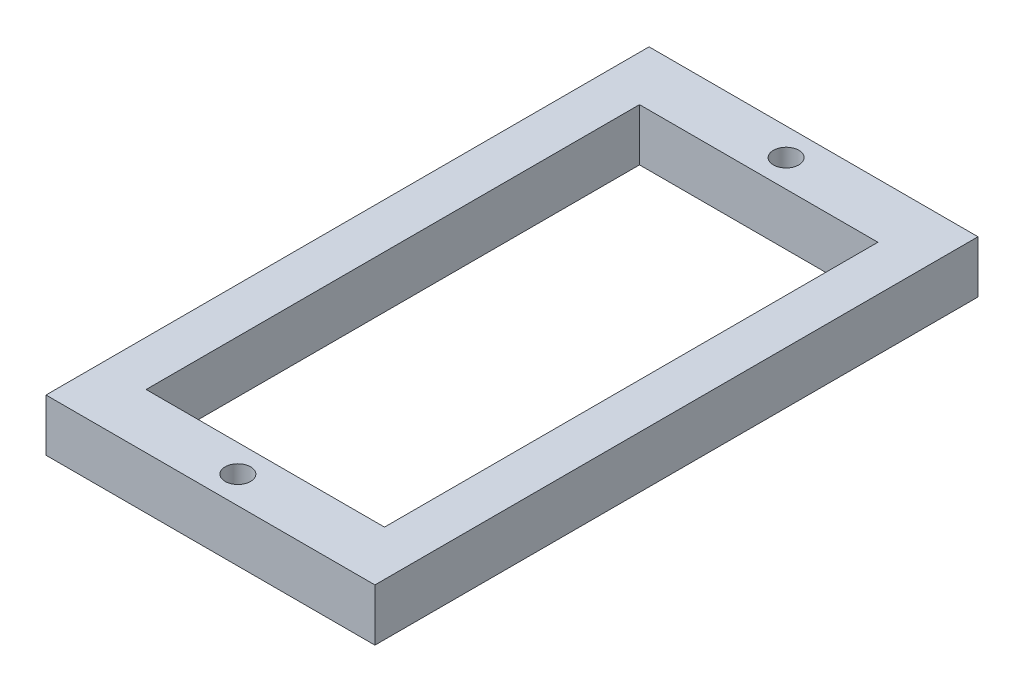
ISO-10303-21;
HEADER;
FILE_DESCRIPTION(('STEP AP214'),'2;1');
FILE_NAME('part.step','',(''),(''),'','','');
FILE_SCHEMA(('AUTOMOTIVE_DESIGN { 1 0 10303 214 1 1 1 1 }'));
ENDSEC;
DATA;
#1=APPLICATION_CONTEXT('core data for automotive mechanical design processes');
#2=APPLICATION_PROTOCOL_DEFINITION('international standard','automotive_design',2000,#1);
#3=PRODUCT_CONTEXT('',#1,'mechanical');
#4=PRODUCT('Part','Part','',(#3));
#5=PRODUCT_RELATED_PRODUCT_CATEGORY('part','',(#4));
#6=PRODUCT_DEFINITION_FORMATION('','',#4);
#7=PRODUCT_DEFINITION_CONTEXT('part definition',#1,'design');
#8=PRODUCT_DEFINITION('design','',#6,#7);
#9=PRODUCT_DEFINITION_SHAPE('','',#8);
#10=(LENGTH_UNIT() NAMED_UNIT(*) SI_UNIT(.MILLI.,.METRE.));
#11=(NAMED_UNIT(*) PLANE_ANGLE_UNIT() SI_UNIT($,.RADIAN.));
#12=(NAMED_UNIT(*) SI_UNIT($,.STERADIAN.) SOLID_ANGLE_UNIT());
#13=UNCERTAINTY_MEASURE_WITH_UNIT(LENGTH_MEASURE(1.E-05),#10,'distance_accuracy_value','');
#14=(GEOMETRIC_REPRESENTATION_CONTEXT(3) GLOBAL_UNCERTAINTY_ASSIGNED_CONTEXT((#13)) GLOBAL_UNIT_ASSIGNED_CONTEXT((#10,
#11,#12)) REPRESENTATION_CONTEXT('',''));
#15=CARTESIAN_POINT('',(0.,0.,0.));
#16=DIRECTION('',(0.,0.,1.));
#17=DIRECTION('',(1.,0.,0.));
#18=AXIS2_PLACEMENT_3D('',#15,#16,#17);
#19=CARTESIAN_POINT('',(-26.2232434670312,6.0452,24.6752254762952));
#20=DIRECTION('',(0.,1.,0.));
#21=DIRECTION('',(0.,0.,1.));
#22=AXIS2_PLACEMENT_3D('',#19,#20,#21);
#23=PLANE('',#22);
#24=CARTESIAN_POINT('',(-7.17324346703127,6.0452,-41.9997745237048));
#25=DIRECTION('',(0.,1.,0.));
#26=DIRECTION('',(0.,0.,-1.));
#27=AXIS2_PLACEMENT_3D('',#24,#25,#26);
#28=CIRCLE('',#27,1.47319999999999);
#29=CARTESIAN_POINT('',(-7.17324346703127,6.0452,-43.4729745237048));
#30=VERTEX_POINT('',#29);
#31=EDGE_CURVE('E157',#30,#30,#28,.T.);
#32=ORIENTED_EDGE('',*,*,#31,.F.);
#33=EDGE_LOOP('',(#32));
#34=FACE_BOUND('',#33,.T.);
#35=DIRECTION('',(0.,0.,1.));
#36=VECTOR('',#35,1.);
#37=CARTESIAN_POINT('',(-26.2232434670312,6.0452,-45.1747745237048));
#38=LINE('',#37,#36);
#39=CARTESIAN_POINT('',(-26.2232434670312,6.0452,-45.1747745237048));
#40=VERTEX_POINT('',#39);
#41=CARTESIAN_POINT('',(-26.2232434670312,6.0452,24.6752254762952));
#42=VERTEX_POINT('',#41);
#43=EDGE_CURVE('E172',#40,#42,#38,.T.);
#44=ORIENTED_EDGE('',*,*,#43,.T.);
#45=DIRECTION('',(1.,0.,0.));
#46=VECTOR('',#45,1.);
#47=CARTESIAN_POINT('',(-26.2232434670312,6.0452,24.6752254762952));
#48=LINE('',#47,#46);
#49=CARTESIAN_POINT('',(11.8767565329688,6.0452,24.6752254762952));
#50=VERTEX_POINT('',#49);
#51=EDGE_CURVE('E176',#42,#50,#48,.T.);
#52=ORIENTED_EDGE('',*,*,#51,.T.);
#53=DIRECTION('',(0.,0.,-1.));
#54=VECTOR('',#53,1.);
#55=CARTESIAN_POINT('',(11.8767565329688,6.0452,-45.1747745237048));
#56=LINE('',#55,#54);
#57=CARTESIAN_POINT('',(11.8767565329688,6.0452,-45.1747745237048));
#58=VERTEX_POINT('',#57);
#59=EDGE_CURVE('E180',#50,#58,#56,.T.);
#60=ORIENTED_EDGE('',*,*,#59,.T.);
#61=DIRECTION('',(-1.,0.,0.));
#62=VECTOR('',#61,1.);
#63=CARTESIAN_POINT('',(-26.2232434670312,6.0452,-45.1747745237048));
#64=LINE('',#63,#62);
#65=EDGE_CURVE('E183',#58,#40,#64,.T.);
#66=ORIENTED_EDGE('',*,*,#65,.T.);
#67=EDGE_LOOP('',(#44,#52,#60,#66));
#68=FACE_BOUND('',#67,.T.);
#69=DIRECTION('',(-1.,0.,0.));
#70=VECTOR('',#69,1.);
#71=CARTESIAN_POINT('',(-20.9781434670313,6.0452,-38.8247745237048));
#72=LINE('',#71,#70);
#73=CARTESIAN_POINT('',(6.63165653296872,6.0452,-38.8247745237048));
#74=VERTEX_POINT('',#73);
#75=CARTESIAN_POINT('',(-20.9781434670313,6.0452,-38.8247745237048));
#76=VERTEX_POINT('',#75);
#77=EDGE_CURVE('E129',#74,#76,#72,.T.);
#78=ORIENTED_EDGE('',*,*,#77,.F.);
#79=DIRECTION('',(0.,0.,-1.));
#80=VECTOR('',#79,1.);
#81=CARTESIAN_POINT('',(6.63165653296872,6.0452,-38.8247745237048));
#82=LINE('',#81,#80);
#83=CARTESIAN_POINT('',(6.63165653296874,6.0452,18.3252254762951));
#84=VERTEX_POINT('',#83);
#85=EDGE_CURVE('E120',#84,#74,#82,.T.);
#86=ORIENTED_EDGE('',*,*,#85,.F.);
#87=DIRECTION('',(1.,0.,0.));
#88=VECTOR('',#87,1.);
#89=CARTESIAN_POINT('',(-20.9781434670313,6.0452,18.3252254762951));
#90=LINE('',#89,#88);
#91=CARTESIAN_POINT('',(-20.9781434670313,6.0452,18.3252254762951));
#92=VERTEX_POINT('',#91);
#93=EDGE_CURVE('E149',#92,#84,#90,.T.);
#94=ORIENTED_EDGE('',*,*,#93,.F.);
#95=DIRECTION('',(0.,0.,1.));
#96=VECTOR('',#95,1.);
#97=CARTESIAN_POINT('',(-20.9781434670313,6.0452,-38.8247745237048));
#98=LINE('',#97,#96);
#99=EDGE_CURVE('E143',#76,#92,#98,.T.);
#100=ORIENTED_EDGE('',*,*,#99,.F.);
#101=EDGE_LOOP('',(#78,#86,#94,#100));
#102=FACE_BOUND('',#101,.T.);
#103=CARTESIAN_POINT('',(-7.17324346703125,6.0452,21.5002254762952));
#104=DIRECTION('',(0.,1.,0.));
#105=DIRECTION('',(0.,0.,1.));
#106=AXIS2_PLACEMENT_3D('',#103,#104,#105);
#107=CIRCLE('',#106,1.47319999999999);
#108=CARTESIAN_POINT('',(-7.17324346703125,6.0452,22.9734254762952));
#109=VERTEX_POINT('',#108);
#110=EDGE_CURVE('E273',#109,#109,#107,.T.);
#111=ORIENTED_EDGE('',*,*,#110,.F.);
#112=EDGE_LOOP('',(#111));
#113=FACE_BOUND('',#112,.T.);
#114=ADVANCED_FACE('F39',(#34,#68,#102,#113),#23,.T.);
#115=CARTESIAN_POINT('',(-26.2232434670312,0.,24.6752254762952));
#116=DIRECTION('',(0.,1.,0.));
#117=DIRECTION('',(0.,0.,1.));
#118=AXIS2_PLACEMENT_3D('',#115,#116,#117);
#119=PLANE('',#118);
#120=CARTESIAN_POINT('',(-7.17324346703127,0.,-41.9997745237048));
#121=DIRECTION('',(0.,1.,0.));
#122=DIRECTION('',(0.,0.,-1.));
#123=AXIS2_PLACEMENT_3D('',#120,#121,#122);
#124=CIRCLE('',#123,1.47319999999999);
#125=CARTESIAN_POINT('',(-7.17324346703127,0.,-43.4729745237048));
#126=VERTEX_POINT('',#125);
#127=EDGE_CURVE('E281',#126,#126,#124,.T.);
#128=ORIENTED_EDGE('',*,*,#127,.T.);
#129=EDGE_LOOP('',(#128));
#130=FACE_BOUND('',#129,.T.);
#131=DIRECTION('',(0.,0.,1.));
#132=VECTOR('',#131,1.);
#133=CARTESIAN_POINT('',(-26.2232434670312,0.,-45.1747745237048));
#134=LINE('',#133,#132);
#135=CARTESIAN_POINT('',(-26.2232434670312,0.,-45.1747745237048));
#136=VERTEX_POINT('',#135);
#137=CARTESIAN_POINT('',(-26.2232434670312,0.,24.6752254762952));
#138=VERTEX_POINT('',#137);
#139=EDGE_CURVE('E138',#136,#138,#134,.T.);
#140=ORIENTED_EDGE('',*,*,#139,.F.);
#141=DIRECTION('',(-1.,0.,0.));
#142=VECTOR('',#141,1.);
#143=CARTESIAN_POINT('',(-26.2232434670312,0.,-45.1747745237048));
#144=LINE('',#143,#142);
#145=CARTESIAN_POINT('',(11.8767565329688,0.,-45.1747745237048));
#146=VERTEX_POINT('',#145);
#147=EDGE_CURVE('E177',#146,#136,#144,.T.);
#148=ORIENTED_EDGE('',*,*,#147,.F.);
#149=DIRECTION('',(0.,0.,-1.));
#150=VECTOR('',#149,1.);
#151=CARTESIAN_POINT('',(11.8767565329688,0.,-45.1747745237048));
#152=LINE('',#151,#150);
#153=CARTESIAN_POINT('',(11.8767565329688,0.,24.6752254762952));
#154=VERTEX_POINT('',#153);
#155=EDGE_CURVE('E192',#154,#146,#152,.T.);
#156=ORIENTED_EDGE('',*,*,#155,.F.);
#157=DIRECTION('',(1.,0.,0.));
#158=VECTOR('',#157,1.);
#159=CARTESIAN_POINT('',(-26.2232434670312,0.,24.6752254762952));
#160=LINE('',#159,#158);
#161=EDGE_CURVE('E189',#138,#154,#160,.T.);
#162=ORIENTED_EDGE('',*,*,#161,.F.);
#163=EDGE_LOOP('',(#140,#148,#156,#162));
#164=FACE_BOUND('',#163,.T.);
#165=DIRECTION('',(0.,0.,-1.));
#166=VECTOR('',#165,1.);
#167=CARTESIAN_POINT('',(6.63165653296872,0.,-38.8247745237048));
#168=LINE('',#167,#166);
#169=CARTESIAN_POINT('',(6.63165653296873,0.,18.3252254762951));
#170=VERTEX_POINT('',#169);
#171=CARTESIAN_POINT('',(6.63165653296872,0.,-38.8247745237048));
#172=VERTEX_POINT('',#171);
#173=EDGE_CURVE('E69',#170,#172,#168,.T.);
#174=ORIENTED_EDGE('',*,*,#173,.T.);
#175=DIRECTION('',(-1.,0.,0.));
#176=VECTOR('',#175,1.);
#177=CARTESIAN_POINT('',(-20.9781434670313,0.,-38.8247745237048));
#178=LINE('',#177,#176);
#179=CARTESIAN_POINT('',(-20.9781434670313,0.,-38.8247745237048));
#180=VERTEX_POINT('',#179);
#181=EDGE_CURVE('E136',#172,#180,#178,.T.);
#182=ORIENTED_EDGE('',*,*,#181,.T.);
#183=DIRECTION('',(0.,0.,1.));
#184=VECTOR('',#183,1.);
#185=CARTESIAN_POINT('',(-20.9781434670313,0.,-38.8247745237048));
#186=LINE('',#185,#184);
#187=CARTESIAN_POINT('',(-20.9781434670313,0.,18.3252254762951));
#188=VERTEX_POINT('',#187);
#189=EDGE_CURVE('E159',#180,#188,#186,.T.);
#190=ORIENTED_EDGE('',*,*,#189,.T.);
#191=DIRECTION('',(1.,0.,0.));
#192=VECTOR('',#191,1.);
#193=CARTESIAN_POINT('',(-20.9781434670313,0.,18.3252254762951));
#194=LINE('',#193,#192);
#195=EDGE_CURVE('E130',#188,#170,#194,.T.);
#196=ORIENTED_EDGE('',*,*,#195,.T.);
#197=EDGE_LOOP('',(#174,#182,#190,#196));
#198=FACE_BOUND('',#197,.T.);
#199=CARTESIAN_POINT('',(-7.17324346703125,0.,21.5002254762952));
#200=DIRECTION('',(0.,1.,0.));
#201=DIRECTION('',(0.,0.,1.));
#202=AXIS2_PLACEMENT_3D('',#199,#200,#201);
#203=CIRCLE('',#202,1.47319999999999);
#204=CARTESIAN_POINT('',(-7.17324346703125,0.,22.9734254762952));
#205=VERTEX_POINT('',#204);
#206=EDGE_CURVE('E276',#205,#205,#203,.T.);
#207=ORIENTED_EDGE('',*,*,#206,.T.);
#208=EDGE_LOOP('',(#207));
#209=FACE_BOUND('',#208,.T.);
#210=ADVANCED_FACE('F215',(#130,#164,#198,#209),#119,.F.);
#211=CARTESIAN_POINT('',(-26.2232434670312,6.0452,-45.1747745237048));
#212=DIRECTION('',(1.,0.,0.));
#213=DIRECTION('',(0.,0.,-1.));
#214=AXIS2_PLACEMENT_3D('',#211,#212,#213);
#215=PLANE('',#214);
#216=ORIENTED_EDGE('',*,*,#139,.T.);
#217=DIRECTION('',(0.,-1.,0.));
#218=VECTOR('',#217,1.);
#219=CARTESIAN_POINT('',(-26.2232434670312,6.0452,24.6752254762952));
#220=LINE('',#219,#218);
#221=EDGE_CURVE('E11',#42,#138,#220,.T.);
#222=ORIENTED_EDGE('',*,*,#221,.F.);
#223=ORIENTED_EDGE('',*,*,#43,.F.);
#224=DIRECTION('',(0.,-1.,0.));
#225=VECTOR('',#224,1.);
#226=CARTESIAN_POINT('',(-26.2232434670312,6.0452,-45.1747745237048));
#227=LINE('',#226,#225);
#228=EDGE_CURVE('E186',#40,#136,#227,.T.);
#229=ORIENTED_EDGE('',*,*,#228,.T.);
#230=EDGE_LOOP('',(#216,#222,#223,#229));
#231=FACE_BOUND('',#230,.T.);
#232=ADVANCED_FACE('F41',(#231),#215,.F.);
#233=CARTESIAN_POINT('',(-26.2232434670312,6.0452,24.6752254762952));
#234=DIRECTION('',(0.,0.,-1.));
#235=DIRECTION('',(-1.,0.,0.));
#236=AXIS2_PLACEMENT_3D('',#233,#234,#235);
#237=PLANE('',#236);
#238=ORIENTED_EDGE('',*,*,#161,.T.);
#239=DIRECTION('',(0.,-1.,0.));
#240=VECTOR('',#239,1.);
#241=CARTESIAN_POINT('',(11.8767565329688,6.0452,24.6752254762952));
#242=LINE('',#241,#240);
#243=EDGE_CURVE('E48',#50,#154,#242,.T.);
#244=ORIENTED_EDGE('',*,*,#243,.F.);
#245=ORIENTED_EDGE('',*,*,#51,.F.);
#246=ORIENTED_EDGE('',*,*,#221,.T.);
#247=EDGE_LOOP('',(#238,#244,#245,#246));
#248=FACE_BOUND('',#247,.T.);
#249=ADVANCED_FACE('F225',(#248),#237,.F.);
#250=CARTESIAN_POINT('',(11.8767565329688,6.0452,-45.1747745237048));
#251=DIRECTION('',(-1.,0.,0.));
#252=DIRECTION('',(0.,0.,1.));
#253=AXIS2_PLACEMENT_3D('',#250,#251,#252);
#254=PLANE('',#253);
#255=ORIENTED_EDGE('',*,*,#155,.T.);
#256=DIRECTION('',(0.,-1.,0.));
#257=VECTOR('',#256,1.);
#258=CARTESIAN_POINT('',(11.8767565329688,6.0452,-45.1747745237048));
#259=LINE('',#258,#257);
#260=EDGE_CURVE('E200',#58,#146,#259,.T.);
#261=ORIENTED_EDGE('',*,*,#260,.F.);
#262=ORIENTED_EDGE('',*,*,#59,.F.);
#263=ORIENTED_EDGE('',*,*,#243,.T.);
#264=EDGE_LOOP('',(#255,#261,#262,#263));
#265=FACE_BOUND('',#264,.T.);
#266=ADVANCED_FACE('F209',(#265),#254,.F.);
#267=CARTESIAN_POINT('',(-26.2232434670312,6.0452,-45.1747745237048));
#268=DIRECTION('',(0.,0.,1.));
#269=DIRECTION('',(1.,0.,0.));
#270=AXIS2_PLACEMENT_3D('',#267,#268,#269);
#271=PLANE('',#270);
#272=ORIENTED_EDGE('',*,*,#147,.T.);
#273=ORIENTED_EDGE('',*,*,#228,.F.);
#274=ORIENTED_EDGE('',*,*,#65,.F.);
#275=ORIENTED_EDGE('',*,*,#260,.T.);
#276=EDGE_LOOP('',(#272,#273,#274,#275));
#277=FACE_BOUND('',#276,.T.);
#278=ADVANCED_FACE('F219',(#277),#271,.F.);
#279=CARTESIAN_POINT('',(6.63165653296872,6.0452,-38.8247745237048));
#280=DIRECTION('',(-1.,0.,0.));
#281=DIRECTION('',(0.,0.,1.));
#282=AXIS2_PLACEMENT_3D('',#279,#280,#281);
#283=PLANE('',#282);
#284=ORIENTED_EDGE('',*,*,#173,.F.);
#285=DIRECTION('',(0.,-1.,0.));
#286=VECTOR('',#285,1.);
#287=CARTESIAN_POINT('',(6.63165653296874,6.0452,18.3252254762951));
#288=LINE('',#287,#286);
#289=EDGE_CURVE('E124',#84,#170,#288,.T.);
#290=ORIENTED_EDGE('',*,*,#289,.F.);
#291=ORIENTED_EDGE('',*,*,#85,.T.);
#292=DIRECTION('',(0.,-1.,0.));
#293=VECTOR('',#292,1.);
#294=CARTESIAN_POINT('',(6.63165653296872,6.0452,-38.8247745237048));
#295=LINE('',#294,#293);
#296=EDGE_CURVE('E123',#74,#172,#295,.T.);
#297=ORIENTED_EDGE('',*,*,#296,.T.);
#298=EDGE_LOOP('',(#284,#290,#291,#297));
#299=FACE_BOUND('',#298,.T.);
#300=ADVANCED_FACE('F122',(#299),#283,.T.);
#301=CARTESIAN_POINT('',(-20.9781434670313,6.0452,-38.8247745237048));
#302=DIRECTION('',(0.,0.,1.));
#303=DIRECTION('',(1.,0.,0.));
#304=AXIS2_PLACEMENT_3D('',#301,#302,#303);
#305=PLANE('',#304);
#306=ORIENTED_EDGE('',*,*,#181,.F.);
#307=ORIENTED_EDGE('',*,*,#296,.F.);
#308=ORIENTED_EDGE('',*,*,#77,.T.);
#309=DIRECTION('',(0.,-1.,0.));
#310=VECTOR('',#309,1.);
#311=CARTESIAN_POINT('',(-20.9781434670313,6.0452,-38.8247745237048));
#312=LINE('',#311,#310);
#313=EDGE_CURVE('E139',#76,#180,#312,.T.);
#314=ORIENTED_EDGE('',*,*,#313,.T.);
#315=EDGE_LOOP('',(#306,#307,#308,#314));
#316=FACE_BOUND('',#315,.T.);
#317=ADVANCED_FACE('F133',(#316),#305,.T.);
#318=CARTESIAN_POINT('',(-20.9781434670313,6.0452,-38.8247745237048));
#319=DIRECTION('',(1.,0.,0.));
#320=DIRECTION('',(0.,0.,-1.));
#321=AXIS2_PLACEMENT_3D('',#318,#319,#320);
#322=PLANE('',#321);
#323=ORIENTED_EDGE('',*,*,#189,.F.);
#324=ORIENTED_EDGE('',*,*,#313,.F.);
#325=ORIENTED_EDGE('',*,*,#99,.T.);
#326=DIRECTION('',(0.,-1.,0.));
#327=VECTOR('',#326,1.);
#328=CARTESIAN_POINT('',(-20.9781434670313,6.0452,18.3252254762951));
#329=LINE('',#328,#327);
#330=EDGE_CURVE('E58',#92,#188,#329,.T.);
#331=ORIENTED_EDGE('',*,*,#330,.T.);
#332=EDGE_LOOP('',(#323,#324,#325,#331));
#333=FACE_BOUND('',#332,.T.);
#334=ADVANCED_FACE('F251',(#333),#322,.T.);
#335=CARTESIAN_POINT('',(-20.9781434670313,6.0452,18.3252254762951));
#336=DIRECTION('',(0.,0.,-1.));
#337=DIRECTION('',(-1.,0.,0.));
#338=AXIS2_PLACEMENT_3D('',#335,#336,#337);
#339=PLANE('',#338);
#340=ORIENTED_EDGE('',*,*,#195,.F.);
#341=ORIENTED_EDGE('',*,*,#330,.F.);
#342=ORIENTED_EDGE('',*,*,#93,.T.);
#343=ORIENTED_EDGE('',*,*,#289,.T.);
#344=EDGE_LOOP('',(#340,#341,#342,#343));
#345=FACE_BOUND('',#344,.T.);
#346=ADVANCED_FACE('F255',(#345),#339,.T.);
#347=CARTESIAN_POINT('',(-7.17324346703127,6.0452,-41.9997745237048));
#348=DIRECTION('',(0.,-1.,0.));
#349=DIRECTION('',(0.,0.,-1.));
#350=AXIS2_PLACEMENT_3D('',#347,#348,#349);
#351=CYLINDRICAL_SURFACE('',#350,1.47319999999999);
#352=ORIENTED_EDGE('',*,*,#31,.T.);
#353=EDGE_LOOP('',(#352));
#354=FACE_BOUND('',#353,.T.);
#355=ORIENTED_EDGE('',*,*,#127,.F.);
#356=EDGE_LOOP('',(#355));
#357=FACE_BOUND('',#356,.T.);
#358=ADVANCED_FACE('F261',(#354,#357),#351,.F.);
#359=CARTESIAN_POINT('',(-7.17324346703125,6.0452,21.5002254762952));
#360=DIRECTION('',(0.,-1.,0.));
#361=DIRECTION('',(0.,0.,-1.));
#362=AXIS2_PLACEMENT_3D('',#359,#360,#361);
#363=CYLINDRICAL_SURFACE('',#362,1.47319999999999);
#364=ORIENTED_EDGE('',*,*,#110,.T.);
#365=EDGE_LOOP('',(#364));
#366=FACE_BOUND('',#365,.T.);
#367=ORIENTED_EDGE('',*,*,#206,.F.);
#368=EDGE_LOOP('',(#367));
#369=FACE_BOUND('',#368,.T.);
#370=ADVANCED_FACE('F264',(#366,#369),#363,.F.);
#371=CLOSED_SHELL('',(#114,#210,#232,#249,#266,#278,#300,#317,#334,#346,#358,#370));
#372=MANIFOLD_SOLID_BREP('B2',#371);
#373=ADVANCED_BREP_SHAPE_REPRESENTATION('',(#18,#372),#14);
#374=SHAPE_DEFINITION_REPRESENTATION(#9,#373);
ENDSEC;
END-ISO-10303-21;
